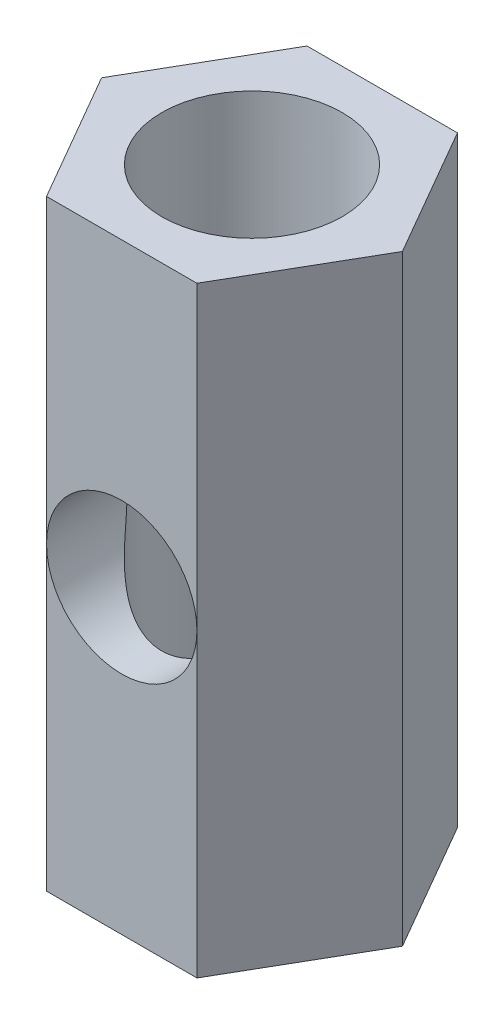
ISO-10303-21;
HEADER;
FILE_DESCRIPTION(('STEP AP214'),'2;1');
FILE_NAME('part.step','',(''),(''),'','','');
FILE_SCHEMA(('AUTOMOTIVE_DESIGN { 1 0 10303 214 1 1 1 1 }'));
ENDSEC;
DATA;
#1=APPLICATION_CONTEXT('core data for automotive mechanical design processes');
#2=APPLICATION_PROTOCOL_DEFINITION('international standard','automotive_design',2000,#1);
#3=PRODUCT_CONTEXT('',#1,'mechanical');
#4=PRODUCT('Part','Part','',(#3));
#5=PRODUCT_RELATED_PRODUCT_CATEGORY('part','',(#4));
#6=PRODUCT_DEFINITION_FORMATION('','',#4);
#7=PRODUCT_DEFINITION_CONTEXT('part definition',#1,'design');
#8=PRODUCT_DEFINITION('design','',#6,#7);
#9=PRODUCT_DEFINITION_SHAPE('','',#8);
#10=(LENGTH_UNIT() NAMED_UNIT(*) SI_UNIT(.MILLI.,.METRE.));
#11=(NAMED_UNIT(*) PLANE_ANGLE_UNIT() SI_UNIT($,.RADIAN.));
#12=(NAMED_UNIT(*) SI_UNIT($,.STERADIAN.) SOLID_ANGLE_UNIT());
#13=UNCERTAINTY_MEASURE_WITH_UNIT(LENGTH_MEASURE(1.E-05),#10,'distance_accuracy_value','');
#14=(GEOMETRIC_REPRESENTATION_CONTEXT(3) GLOBAL_UNCERTAINTY_ASSIGNED_CONTEXT((#13)) GLOBAL_UNIT_ASSIGNED_CONTEXT((#10,
#11,#12)) REPRESENTATION_CONTEXT('',''));
#15=CARTESIAN_POINT('',(0.,0.,0.));
#16=DIRECTION('',(0.,0.,1.));
#17=DIRECTION('',(1.,0.,0.));
#18=AXIS2_PLACEMENT_3D('',#15,#16,#17);
#19=CARTESIAN_POINT('',(-1.25,10.,2.1650635094611));
#20=DIRECTION('',(0.,0.,-1.));
#21=DIRECTION('',(-1.,0.,0.));
#22=AXIS2_PLACEMENT_3D('',#19,#20,#21);
#23=PLANE('',#22);
#24=DIRECTION('',(0.,-1.,0.));
#25=VECTOR('',#24,1.);
#26=CARTESIAN_POINT('',(-1.25,10.,2.1650635094611));
#27=LINE('',#26,#25);
#28=CARTESIAN_POINT('',(-1.25,10.,2.1650635094611));
#29=VERTEX_POINT('',#28);
#30=CARTESIAN_POINT('',(-1.25,5.,2.1650635094611));
#31=VERTEX_POINT('',#30);
#32=EDGE_CURVE('E185',#29,#31,#27,.T.);
#33=ORIENTED_EDGE('',*,*,#32,.T.);
#34=CARTESIAN_POINT('',(0.,5.,2.1650635094611));
#35=DIRECTION('',(0.,0.,1.));
#36=DIRECTION('',(1.,0.,0.));
#37=AXIS2_PLACEMENT_3D('',#34,#35,#36);
#38=CIRCLE('',#37,1.25);
#39=CARTESIAN_POINT('',(1.25,5.,2.1650635094611));
#40=VERTEX_POINT('',#39);
#41=EDGE_CURVE('E62',#40,#31,#38,.T.);
#42=ORIENTED_EDGE('',*,*,#41,.F.);
#43=DIRECTION('',(0.,-1.,0.));
#44=VECTOR('',#43,1.);
#45=CARTESIAN_POINT('',(1.25,10.,2.1650635094611));
#46=LINE('',#45,#44);
#47=CARTESIAN_POINT('',(1.25,10.,2.1650635094611));
#48=VERTEX_POINT('',#47);
#49=EDGE_CURVE('E11',#48,#40,#46,.T.);
#50=ORIENTED_EDGE('',*,*,#49,.F.);
#51=DIRECTION('',(1.,0.,0.));
#52=VECTOR('',#51,1.);
#53=CARTESIAN_POINT('',(-1.25,10.,2.1650635094611));
#54=LINE('',#53,#52);
#55=EDGE_CURVE('E183',#29,#48,#54,.T.);
#56=ORIENTED_EDGE('',*,*,#55,.F.);
#57=EDGE_LOOP('',(#33,#42,#50,#56));
#58=FACE_BOUND('',#57,.T.);
#59=ADVANCED_FACE('F35',(#58),#23,.F.);
#60=CARTESIAN_POINT('',(1.25,10.,-2.1650635094611));
#61=DIRECTION('',(0.,0.,1.));
#62=DIRECTION('',(1.,0.,0.));
#63=AXIS2_PLACEMENT_3D('',#60,#61,#62);
#64=PLANE('',#63);
#65=DIRECTION('',(0.,-1.,0.));
#66=VECTOR('',#65,1.);
#67=CARTESIAN_POINT('',(1.25,10.,-2.1650635094611));
#68=LINE('',#67,#66);
#69=CARTESIAN_POINT('',(1.25,10.,-2.1650635094611));
#70=VERTEX_POINT('',#69);
#71=CARTESIAN_POINT('',(1.25,5.,-2.1650635094611));
#72=VERTEX_POINT('',#71);
#73=EDGE_CURVE('E119',#70,#72,#68,.T.);
#74=ORIENTED_EDGE('',*,*,#73,.T.);
#75=CARTESIAN_POINT('',(0.,5.,-2.1650635094611));
#76=DIRECTION('',(0.,0.,1.));
#77=DIRECTION('',(1.,0.,0.));
#78=AXIS2_PLACEMENT_3D('',#75,#76,#77);
#79=CIRCLE('',#78,1.25);
#80=CARTESIAN_POINT('',(-1.25,5.,-2.1650635094611));
#81=VERTEX_POINT('',#80);
#82=EDGE_CURVE('E55',#72,#81,#79,.T.);
#83=ORIENTED_EDGE('',*,*,#82,.T.);
#84=DIRECTION('',(0.,-1.,0.));
#85=VECTOR('',#84,1.);
#86=CARTESIAN_POINT('',(-1.25,10.,-2.1650635094611));
#87=LINE('',#86,#85);
#88=CARTESIAN_POINT('',(-1.25,10.,-2.1650635094611));
#89=VERTEX_POINT('',#88);
#90=EDGE_CURVE('E116',#89,#81,#87,.T.);
#91=ORIENTED_EDGE('',*,*,#90,.F.);
#92=DIRECTION('',(-1.,0.,0.));
#93=VECTOR('',#92,1.);
#94=CARTESIAN_POINT('',(1.25,10.,-2.1650635094611));
#95=LINE('',#94,#93);
#96=EDGE_CURVE('E199',#70,#89,#95,.T.);
#97=ORIENTED_EDGE('',*,*,#96,.F.);
#98=EDGE_LOOP('',(#74,#83,#91,#97));
#99=FACE_BOUND('',#98,.T.);
#100=ADVANCED_FACE('F113',(#99),#64,.F.);
#101=CARTESIAN_POINT('',(0.,10.,0.));
#102=DIRECTION('',(0.,1.,0.));
#103=DIRECTION('',(0.,0.,1.));
#104=AXIS2_PLACEMENT_3D('',#101,#102,#103);
#105=PLANE('',#104);
#106=ORIENTED_EDGE('',*,*,#55,.T.);
#107=DIRECTION('',(0.5,0.,-0.866025403784439));
#108=VECTOR('',#107,1.);
#109=CARTESIAN_POINT('',(1.25,10.,2.1650635094611));
#110=LINE('',#109,#108);
#111=CARTESIAN_POINT('',(2.5,10.,0.));
#112=VERTEX_POINT('',#111);
#113=EDGE_CURVE('E180',#48,#112,#110,.T.);
#114=ORIENTED_EDGE('',*,*,#113,.T.);
#115=DIRECTION('',(-0.499999999999999,0.,-0.866025403784439));
#116=VECTOR('',#115,1.);
#117=CARTESIAN_POINT('',(2.5,10.,0.));
#118=LINE('',#117,#116);
#119=EDGE_CURVE('E197',#112,#70,#118,.T.);
#120=ORIENTED_EDGE('',*,*,#119,.T.);
#121=ORIENTED_EDGE('',*,*,#96,.T.);
#122=DIRECTION('',(-0.5,0.,0.866025403784438));
#123=VECTOR('',#122,1.);
#124=CARTESIAN_POINT('',(-1.25,10.,-2.1650635094611));
#125=LINE('',#124,#123);
#126=CARTESIAN_POINT('',(-2.5,10.,0.));
#127=VERTEX_POINT('',#126);
#128=EDGE_CURVE('E132',#89,#127,#125,.T.);
#129=ORIENTED_EDGE('',*,*,#128,.T.);
#130=DIRECTION('',(0.499999999999999,0.,0.866025403784439));
#131=VECTOR('',#130,1.);
#132=CARTESIAN_POINT('',(-2.5,10.,0.));
#133=LINE('',#132,#131);
#134=EDGE_CURVE('E202',#127,#29,#133,.T.);
#135=ORIENTED_EDGE('',*,*,#134,.T.);
#136=EDGE_LOOP('',(#106,#114,#120,#121,#129,#135));
#137=FACE_BOUND('',#136,.T.);
#138=CARTESIAN_POINT('',(0.,10.,0.));
#139=DIRECTION('',(0.,1.,0.));
#140=DIRECTION('',(0.,0.,1.));
#141=AXIS2_PLACEMENT_3D('',#138,#139,#140);
#142=CIRCLE('',#141,1.5);
#143=CARTESIAN_POINT('',(0.,10.,1.5));
#144=VERTEX_POINT('',#143);
#145=EDGE_CURVE('E191',#144,#144,#142,.T.);
#146=ORIENTED_EDGE('',*,*,#145,.F.);
#147=EDGE_LOOP('',(#146));
#148=FACE_BOUND('',#147,.T.);
#149=ADVANCED_FACE('F158',(#137,#148),#105,.T.);
#150=CARTESIAN_POINT('',(1.25,0.,2.1650635094611));
#151=VERTEX_POINT('',#150);
#152=EDGE_CURVE('E48',#40,#151,#46,.T.);
#153=ORIENTED_EDGE('',*,*,#152,.F.);
#154=EDGE_CURVE('E173',#31,#40,#38,.T.);
#155=ORIENTED_EDGE('',*,*,#154,.F.);
#156=CARTESIAN_POINT('',(-1.25,0.,2.1650635094611));
#157=VERTEX_POINT('',#156);
#158=EDGE_CURVE('E204',#31,#157,#27,.T.);
#159=ORIENTED_EDGE('',*,*,#158,.T.);
#160=DIRECTION('',(1.,0.,0.));
#161=VECTOR('',#160,1.);
#162=CARTESIAN_POINT('',(-1.25,0.,2.1650635094611));
#163=LINE('',#162,#161);
#164=EDGE_CURVE('E176',#157,#151,#163,.T.);
#165=ORIENTED_EDGE('',*,*,#164,.T.);
#166=EDGE_LOOP('',(#153,#155,#159,#165));
#167=FACE_BOUND('',#166,.T.);
#168=ADVANCED_FACE('F37',(#167),#23,.F.);
#169=CARTESIAN_POINT('',(1.25,10.,2.1650635094611));
#170=DIRECTION('',(-0.866025403784439,0.,-0.5));
#171=DIRECTION('',(-0.5,0.,0.866025403784439));
#172=AXIS2_PLACEMENT_3D('',#169,#170,#171);
#173=PLANE('',#172);
#174=DIRECTION('',(0.5,0.,-0.866025403784439));
#175=VECTOR('',#174,1.);
#176=CARTESIAN_POINT('',(1.25,0.,2.1650635094611));
#177=LINE('',#176,#175);
#178=CARTESIAN_POINT('',(2.5,0.,0.));
#179=VERTEX_POINT('',#178);
#180=EDGE_CURVE('E206',#151,#179,#177,.T.);
#181=ORIENTED_EDGE('',*,*,#180,.T.);
#182=DIRECTION('',(0.,-1.,0.));
#183=VECTOR('',#182,1.);
#184=CARTESIAN_POINT('',(2.5,10.,0.));
#185=LINE('',#184,#183);
#186=EDGE_CURVE('E138',#112,#179,#185,.T.);
#187=ORIENTED_EDGE('',*,*,#186,.F.);
#188=ORIENTED_EDGE('',*,*,#113,.F.);
#189=ORIENTED_EDGE('',*,*,#49,.T.);
#190=ORIENTED_EDGE('',*,*,#152,.T.);
#191=EDGE_LOOP('',(#181,#187,#188,#189,#190));
#192=FACE_BOUND('',#191,.T.);
#193=ADVANCED_FACE('F162',(#192),#173,.F.);
#194=CARTESIAN_POINT('',(2.5,10.,0.));
#195=DIRECTION('',(-0.866025403784439,0.,0.499999999999999));
#196=DIRECTION('',(0.499999999999999,0.,0.866025403784439));
#197=AXIS2_PLACEMENT_3D('',#194,#195,#196);
#198=PLANE('',#197);
#199=DIRECTION('',(-0.499999999999999,0.,-0.866025403784439));
#200=VECTOR('',#199,1.);
#201=CARTESIAN_POINT('',(2.5,0.,0.));
#202=LINE('',#201,#200);
#203=CARTESIAN_POINT('',(1.25,0.,-2.1650635094611));
#204=VERTEX_POINT('',#203);
#205=EDGE_CURVE('E208',#179,#204,#202,.T.);
#206=ORIENTED_EDGE('',*,*,#205,.T.);
#207=EDGE_CURVE('E133',#72,#204,#68,.T.);
#208=ORIENTED_EDGE('',*,*,#207,.F.);
#209=ORIENTED_EDGE('',*,*,#73,.F.);
#210=ORIENTED_EDGE('',*,*,#119,.F.);
#211=ORIENTED_EDGE('',*,*,#186,.T.);
#212=EDGE_LOOP('',(#206,#208,#209,#210,#211));
#213=FACE_BOUND('',#212,.T.);
#214=ADVANCED_FACE('F168',(#213),#198,.F.);
#215=CARTESIAN_POINT('',(-1.25,0.,-2.1650635094611));
#216=VERTEX_POINT('',#215);
#217=EDGE_CURVE('E122',#81,#216,#87,.T.);
#218=ORIENTED_EDGE('',*,*,#217,.F.);
#219=EDGE_CURVE('E103',#81,#72,#79,.T.);
#220=ORIENTED_EDGE('',*,*,#219,.T.);
#221=ORIENTED_EDGE('',*,*,#207,.T.);
#222=DIRECTION('',(-1.,0.,0.));
#223=VECTOR('',#222,1.);
#224=CARTESIAN_POINT('',(1.25,0.,-2.1650635094611));
#225=LINE('',#224,#223);
#226=EDGE_CURVE('E125',#204,#216,#225,.T.);
#227=ORIENTED_EDGE('',*,*,#226,.T.);
#228=EDGE_LOOP('',(#218,#220,#221,#227));
#229=FACE_BOUND('',#228,.T.);
#230=ADVANCED_FACE('F123',(#229),#64,.F.);
#231=CARTESIAN_POINT('',(-1.25,10.,-2.1650635094611));
#232=DIRECTION('',(0.866025403784438,0.,0.5));
#233=DIRECTION('',(0.500000000000001,0.,-0.866025403784438));
#234=AXIS2_PLACEMENT_3D('',#231,#232,#233);
#235=PLANE('',#234);
#236=DIRECTION('',(-0.5,0.,0.866025403784438));
#237=VECTOR('',#236,1.);
#238=CARTESIAN_POINT('',(-1.25,0.,-2.1650635094611));
#239=LINE('',#238,#237);
#240=CARTESIAN_POINT('',(-2.5,0.,0.));
#241=VERTEX_POINT('',#240);
#242=EDGE_CURVE('E212',#216,#241,#239,.T.);
#243=ORIENTED_EDGE('',*,*,#242,.T.);
#244=DIRECTION('',(0.,-1.,0.));
#245=VECTOR('',#244,1.);
#246=CARTESIAN_POINT('',(-2.5,10.,0.));
#247=LINE('',#246,#245);
#248=EDGE_CURVE('E128',#127,#241,#247,.T.);
#249=ORIENTED_EDGE('',*,*,#248,.F.);
#250=ORIENTED_EDGE('',*,*,#128,.F.);
#251=ORIENTED_EDGE('',*,*,#90,.T.);
#252=ORIENTED_EDGE('',*,*,#217,.T.);
#253=EDGE_LOOP('',(#243,#249,#250,#251,#252));
#254=FACE_BOUND('',#253,.T.);
#255=ADVANCED_FACE('F130',(#254),#235,.F.);
#256=CARTESIAN_POINT('',(-2.5,10.,0.));
#257=DIRECTION('',(0.866025403784439,0.,-0.499999999999999));
#258=DIRECTION('',(-0.499999999999999,0.,-0.866025403784439));
#259=AXIS2_PLACEMENT_3D('',#256,#257,#258);
#260=PLANE('',#259);
#261=DIRECTION('',(0.499999999999999,0.,0.866025403784439));
#262=VECTOR('',#261,1.);
#263=CARTESIAN_POINT('',(-2.5,0.,0.));
#264=LINE('',#263,#262);
#265=EDGE_CURVE('E195',#241,#157,#264,.T.);
#266=ORIENTED_EDGE('',*,*,#265,.T.);
#267=ORIENTED_EDGE('',*,*,#158,.F.);
#268=ORIENTED_EDGE('',*,*,#32,.F.);
#269=ORIENTED_EDGE('',*,*,#134,.F.);
#270=ORIENTED_EDGE('',*,*,#248,.T.);
#271=EDGE_LOOP('',(#266,#267,#268,#269,#270));
#272=FACE_BOUND('',#271,.T.);
#273=ADVANCED_FACE('F218',(#272),#260,.F.);
#274=CARTESIAN_POINT('',(0.,0.,0.));
#275=DIRECTION('',(0.,1.,0.));
#276=DIRECTION('',(0.,0.,1.));
#277=AXIS2_PLACEMENT_3D('',#274,#275,#276);
#278=PLANE('',#277);
#279=CARTESIAN_POINT('',(0.,0.,0.));
#280=DIRECTION('',(0.,-1.,0.));
#281=DIRECTION('',(0.,0.,-1.));
#282=AXIS2_PLACEMENT_3D('',#279,#280,#281);
#283=CIRCLE('',#282,1.5);
#284=CARTESIAN_POINT('',(0.,0.,-1.5));
#285=VERTEX_POINT('',#284);
#286=EDGE_CURVE('E188',#285,#285,#283,.T.);
#287=ORIENTED_EDGE('',*,*,#286,.F.);
#288=EDGE_LOOP('',(#287));
#289=FACE_BOUND('',#288,.T.);
#290=ORIENTED_EDGE('',*,*,#164,.F.);
#291=ORIENTED_EDGE('',*,*,#265,.F.);
#292=ORIENTED_EDGE('',*,*,#242,.F.);
#293=ORIENTED_EDGE('',*,*,#226,.F.);
#294=ORIENTED_EDGE('',*,*,#205,.F.);
#295=ORIENTED_EDGE('',*,*,#180,.F.);
#296=EDGE_LOOP('',(#290,#291,#292,#293,#294,#295));
#297=FACE_BOUND('',#296,.T.);
#298=ADVANCED_FACE('F221',(#289,#297),#278,.F.);
#299=CARTESIAN_POINT('',(0.,15.,0.));
#300=DIRECTION('',(0.,-1.,0.));
#301=DIRECTION('',(0.,0.,-1.));
#302=AXIS2_PLACEMENT_3D('',#299,#300,#301);
#303=CYLINDRICAL_SURFACE('',#302,1.5);
#304=CARTESIAN_POINT('',(0.,6.25,-1.5));
#305=CARTESIAN_POINT('',(0.0593787688504968,6.24999755162014,-1.49999760600508));
#306=CARTESIAN_POINT('',(0.118775657075964,6.24573873608633,-1.49644333306022));
#307=CARTESIAN_POINT('',(0.235591229710263,6.22901865029432,-1.48255383426958));
#308=CARTESIAN_POINT('',(0.293008415894373,6.21655130529972,-1.47221358646978));
#309=CARTESIAN_POINT('',(0.403915034737321,6.18434389929648,-1.44571337985919));
#310=CARTESIAN_POINT('',(0.457425697494257,6.16464730700095,-1.42958821794707));
#311=CARTESIAN_POINT('',(0.55992045809506,6.11899163190361,-1.39264614580735));
#312=CARTESIAN_POINT('',(0.608903018804499,6.09303043320279,-1.37182765054183));
#313=CARTESIAN_POINT('',(0.7189512027702,6.02527232994863,-1.31836960624056));
#314=CARTESIAN_POINT('',(0.77784638468749,5.98116142459715,-1.28419684309181));
#315=CARTESIAN_POINT('',(0.886006690341646,5.88474132022428,-1.21211904371339));
#316=CARTESIAN_POINT('',(0.935244207719105,5.83240936777461,-1.17420376089562));
#317=CARTESIAN_POINT('',(1.02476981505215,5.71947566655176,-1.0969954782186));
#318=CARTESIAN_POINT('',(1.06487540714462,5.6587387889954,-1.05768996729306));
#319=CARTESIAN_POINT('',(1.13460946975339,5.52964932775321,-0.982473378237859));
#320=CARTESIAN_POINT('',(1.16426870455503,5.46131989924884,-0.946552565043526));
#321=CARTESIAN_POINT('',(1.20096809386344,5.34915232182339,-0.898966702929831));
#322=CARTESIAN_POINT('',(1.2121691769959,5.30823415135928,-0.883683453779613));
#323=CARTESIAN_POINT('',(1.23050643018312,5.22405890858107,-0.857964009892268));
#324=CARTESIAN_POINT('',(1.23765246650147,5.1808077960169,-0.847516062002446));
#325=CARTESIAN_POINT('',(1.24740539483339,5.09211619323376,-0.833105139761353));
#326=CARTESIAN_POINT('',(1.24995600781898,5.04665546916851,-0.829222605301797));
#327=CARTESIAN_POINT('',(1.25004286433054,4.95571924480199,-0.829091490172101));
#328=CARTESIAN_POINT('',(1.24757904212979,4.91024374431486,-0.832843009565336));
#329=CARTESIAN_POINT('',(1.23752620102327,4.81723645016103,-0.847707888605652));
#330=CARTESIAN_POINT('',(1.2295274513961,4.76984879740241,-0.859408312456977));
#331=CARTESIAN_POINT('',(1.20871318849993,4.67789885416051,-0.888442533165815));
#332=CARTESIAN_POINT('',(1.19588169148344,4.63334651912334,-0.905794997455962));
#333=CARTESIAN_POINT('',(1.15722563130129,4.52189560230473,-0.955139134708251));
#334=CARTESIAN_POINT('',(1.12819923859671,4.45728511979404,-0.989734541742255));
#335=CARTESIAN_POINT('',(1.06071724104509,4.33497126098837,-1.0617636269616));
#336=CARTESIAN_POINT('',(1.02224478491081,4.2772805059593,-1.09920229401549));
#337=CARTESIAN_POINT('',(0.933838554257845,4.16587958721673,-1.1753849598887));
#338=CARTESIAN_POINT('',(0.883411408236041,4.11253430361172,-1.21409510992798));
#339=CARTESIAN_POINT('',(0.772419565040708,4.0144403695611,-1.28754911495831));
#340=CARTESIAN_POINT('',(0.711877274428603,3.96967317783162,-1.32230145708774));
#341=CARTESIAN_POINT('',(0.597056314169013,3.9002931891689,-1.37714389382958));
#342=CARTESIAN_POINT('',(0.544863772530718,3.87342871405698,-1.39874156893189));
#343=CARTESIAN_POINT('',(0.435535617240939,3.8268284643236,-1.43653920142357));
#344=CARTESIAN_POINT('',(0.378403116632069,3.80708824017554,-1.45274252741888));
#345=CARTESIAN_POINT('',(0.259977180591786,3.77579141940212,-1.47854912184039));
#346=CARTESIAN_POINT('',(0.19865546832505,3.76429803928537,-1.4881013901647));
#347=CARTESIAN_POINT('',(0.0742799817040137,3.7506453714307,-1.49945718724959));
#348=CARTESIAN_POINT('',(0.01122739468355,3.7484798384778,-1.50126590049908));
#349=CARTESIAN_POINT('',(-0.106655102299875,3.75333122508868,-1.49722498729296));
#350=CARTESIAN_POINT('',(-0.161565285324134,3.75927932977238,-1.49226673517921));
#351=CARTESIAN_POINT('',(-0.269322467292295,3.77813346468969,-1.47662796570524));
#352=CARTESIAN_POINT('',(-0.322169217931408,3.79104032956087,-1.46594676193199));
#353=CARTESIAN_POINT('',(-0.425282807428031,3.82331173451289,-1.43944754113185));
#354=CARTESIAN_POINT('',(-0.47550555866547,3.84276053215233,-1.42356257517914));
#355=CARTESIAN_POINT('',(-0.57182928685617,3.88719767868728,-1.38768087304246));
#356=CARTESIAN_POINT('',(-0.617928731328795,3.9121880752831,-1.36768261713727));
#357=CARTESIAN_POINT('',(-0.725338376691815,3.9792166414649,-1.31487441147003));
#358=CARTESIAN_POINT('',(-0.784177111169749,4.02386964637632,-1.2803451352154));
#359=CARTESIAN_POINT('',(-0.892139643516472,4.12141682602765,-1.20761833212685));
#360=CARTESIAN_POINT('',(-0.941232285418756,4.17433649377555,-1.16940960315472));
#361=CARTESIAN_POINT('',(-1.03033901299862,4.28848795246965,-1.09176431315108));
#362=CARTESIAN_POINT('',(-1.07017375330095,4.34985223063404,-1.05231803111603));
#363=CARTESIAN_POINT('',(-1.13922410535012,4.48029258014805,-0.977105860325171));
#364=CARTESIAN_POINT('',(-1.16847444328379,4.54934244271883,-0.941328217251967));
#365=CARTESIAN_POINT('',(-1.20418713962594,4.66214898470544,-0.894635188877059));
#366=CARTESIAN_POINT('',(-1.21494166451886,4.70292093843127,-0.87985553504527));
#367=CARTESIAN_POINT('',(-1.23241118575506,4.7867222734119,-0.855213348293514));
#368=CARTESIAN_POINT('',(-1.23913627036995,4.82974572127115,-0.845338546087726));
#369=CARTESIAN_POINT('',(-1.24808646608227,4.91781988033098,-0.832077095797259));
#370=CARTESIAN_POINT('',(-1.25025897513146,4.96288820694844,-0.828766313990398));
#371=CARTESIAN_POINT('',(-1.2496910063161,5.05292606417594,-0.829621484389405));
#372=CARTESIAN_POINT('',(-1.24694923297196,5.09789556560516,-0.833789408096102));
#373=CARTESIAN_POINT('',(-1.23632620681835,5.19083749596596,-0.849464182651573));
#374=CARTESIAN_POINT('',(-1.22792861456552,5.23861956187494,-0.861705472805828));
#375=CARTESIAN_POINT('',(-1.20625214805457,5.33126120670839,-0.891795027098421));
#376=CARTESIAN_POINT('',(-1.19295712996404,5.37611053579842,-0.909661806430615));
#377=CARTESIAN_POINT('',(-1.15299054037422,5.48834179814999,-0.960293381079566));
#378=CARTESIAN_POINT('',(-1.12305667484075,5.55338132903309,-0.995623570298246));
#379=CARTESIAN_POINT('',(-1.05354944095066,5.67640963589639,-1.06893108151569));
#380=CARTESIAN_POINT('',(-1.01395911755893,5.73438573828657,-1.10691297478657));
#381=CARTESIAN_POINT('',(-0.923157683511356,5.84599075337962,-1.18384825527244));
#382=CARTESIAN_POINT('',(-0.871472234833908,5.89926748450174,-1.22275805975957));
#383=CARTESIAN_POINT('',(-0.757765343279744,5.99693530462558,-1.29628639574608));
#384=CARTESIAN_POINT('',(-0.695767358080718,6.04134606754814,-1.33091436227141));
#385=CARTESIAN_POINT('',(-0.579278005881087,6.10915651690689,-1.38471086227025));
#386=CARTESIAN_POINT('',(-0.526999500141295,6.13501910031224,-1.40556069252779));
#387=CARTESIAN_POINT('',(-0.417719782772166,6.17960948970954,-1.44180748060126));
#388=CARTESIAN_POINT('',(-0.360724986716914,6.1983468000958,-1.45721170036654));
#389=CARTESIAN_POINT('',(-0.253310041564238,6.22509419634338,-1.47929369322442));
#390=CARTESIAN_POINT('',(-0.203422739425068,6.23438755201361,-1.48701070119816));
#391=CARTESIAN_POINT('',(-0.102361357783545,6.24684119321788,-1.49736462476332));
#392=CARTESIAN_POINT('',(-0.0511874114043623,6.25000211062354,-1.50000206374105));
#393=CARTESIAN_POINT('',(0.,6.25,-1.5));
#394=B_SPLINE_CURVE_WITH_KNOTS('',3,(#304,#305,#306,#307,#308,#309,#310,#311,#312,#313,#314,
#315,#316,#317,#318,#319,#320,#321,#322,#323,#324,#325,#326,#327,#328,#329,#330,#331,#332,#333,
#334,#335,#336,#337,#338,#339,#340,#341,#342,#343,#344,#345,#346,#347,#348,#349,#350,#351,#352,
#353,#354,#355,#356,#357,#358,#359,#360,#361,#362,#363,#364,#365,#366,#367,#368,#369,#370,#371,
#372,#373,#374,#375,#376,#377,#378,#379,#380,#381,#382,#383,#384,#385,#386,#387,#388,#389,#390,
#391,#392,#393),.UNSPECIFIED.,.T.,.F.,(4,2,2,2,2,2,2,2,2,2,2,2,2,2,2,2,2,2,2,2,2,2,2,2,2,2,2,2,
2,2,2,2,2,2,2,2,2,2,2,2,2,2,2,2,4),(0.,0.177920638407557,0.35597309551348,0.532972026797753,
0.710030824150578,0.952125893800631,1.19490321558387,1.44217376408651,1.6887098948694,
1.8236131816748,1.95818681458038,2.0943976161209,2.23061020305627,2.37816635242836,
2.52621487430063,2.76143398970636,2.9970758121581,3.24501566810455,3.49241341014753,
3.67933989515107,3.86614943036557,4.0543760919618,4.242476711735,4.40804641875283,
4.57363598871256,4.74144560410123,4.90931733118537,5.152610891086,5.39667010414655,
5.64512295341126,5.89275310452977,6.02641745468303,6.15974574356462,6.29460624678873,
6.42950230652136,6.57876724728639,6.72852869227185,6.96677041328345,7.20543349464891,
7.45579032127001,7.7055852656125,7.89070171070692,8.07557035570182,8.22896247938917,
8.3823387970832),.UNSPECIFIED.);
#395=CARTESIAN_POINT('',(0.,6.25,-1.5));
#396=VERTEX_POINT('',#395);
#397=EDGE_CURVE('E39',#396,#396,#394,.T.);
#398=ORIENTED_EDGE('',*,*,#397,.T.);
#399=EDGE_LOOP('',(#398));
#400=FACE_BOUND('',#399,.T.);
#401=CARTESIAN_POINT('',(1.25,5.,0.829156197588849));
#402=CARTESIAN_POINT('',(1.24999404087226,5.04416470538021,0.829171080733846));
#403=CARTESIAN_POINT('',(1.24763049967423,5.08838352122019,0.832762375395264));
#404=CARTESIAN_POINT('',(1.23841578381773,5.17538530124638,0.84639629042703));
#405=CARTESIAN_POINT('',(1.23154918841669,5.21816279845574,0.856461077033122));
#406=CARTESIAN_POINT('',(1.21043365494066,5.31755543299884,0.886166295980816));
#407=CARTESIAN_POINT('',(1.19435434755409,5.37310208001594,0.908006666466335));
#408=CARTESIAN_POINT('',(1.15573690008527,5.47958263511899,0.956683967866317));
#409=CARTESIAN_POINT('',(1.13317786130272,5.53050090455106,0.983536965992067));
#410=CARTESIAN_POINT('',(1.070817065168,5.64975837508035,1.05182143936407));
#411=CARTESIAN_POINT('',(1.02781025867357,5.71575985410453,1.09442045045525));
#412=CARTESIAN_POINT('',(0.929991014491965,5.83891509928546,1.17868626480119));
#413=CARTESIAN_POINT('',(0.875189620049187,5.89607705641117,1.22035390008919));
#414=CARTESIAN_POINT('',(0.766663658737561,5.98929011660765,1.29053257092503));
#415=CARTESIAN_POINT('',(0.715176307152023,6.02724727919612,1.31995958434628));
#416=CARTESIAN_POINT('',(0.605134546053413,6.09567035779853,1.37388140866488));
#417=CARTESIAN_POINT('',(0.546591815897452,6.12614840737724,1.3983841964128));
#418=CARTESIAN_POINT('',(0.43396568854128,6.173556063108,1.43686412264528));
#419=CARTESIAN_POINT('',(0.380860387543684,6.19191688378329,1.45192852122773));
#420=CARTESIAN_POINT('',(0.27141697450591,6.2214903033312,1.47630204543213));
#421=CARTESIAN_POINT('',(0.215080746020966,6.23270702178971,1.48561448777698));
#422=CARTESIAN_POINT('',(0.100453129804022,6.2473007228839,1.49774576733632));
#423=CARTESIAN_POINT('',(0.0421545865612126,6.25064491421972,1.50053744334289));
#424=CARTESIAN_POINT('',(-0.0742637120693279,6.24914887809637,1.4992907190875));
#425=CARTESIAN_POINT('',(-0.132383471389192,6.24430883194758,1.49525247013301));
#426=CARTESIAN_POINT('',(-0.242722987690762,6.22739289605122,1.48120670588946));
#427=CARTESIAN_POINT('',(-0.295076907899645,6.21582452214335,1.47161807443048));
#428=CARTESIAN_POINT('',(-0.396813223309236,6.18652600330558,1.44750645993));
#429=CARTESIAN_POINT('',(-0.446195191050166,6.16879497446605,1.43298276905958));
#430=CARTESIAN_POINT('',(-0.545266441516649,6.12620474375289,1.39845194139805));
#431=CARTESIAN_POINT('',(-0.594620394489257,6.10086539417457,1.3780819168441));
#432=CARTESIAN_POINT('',(-0.688391071359199,6.04480037361997,1.33372220395884));
#433=CARTESIAN_POINT('',(-0.732803298534893,6.0140698614123,1.30972926499254));
#434=CARTESIAN_POINT('',(-0.83639372253195,5.93227740848526,1.24725283392922));
#435=CARTESIAN_POINT('',(-0.892549793915361,5.8784966096062,1.20730441725272));
#436=CARTESIAN_POINT('',(-0.99363852917749,5.76232443114911,1.1255679714589));
#437=CARTESIAN_POINT('',(-1.03855119382815,5.6999180103951,1.08377681764698));
#438=CARTESIAN_POINT('',(-1.10642031272616,5.58441929350592,1.01367839645618));
#439=CARTESIAN_POINT('',(-1.13203948271785,5.53326254482451,0.984740465846713));
#440=CARTESIAN_POINT('',(-1.17656863192196,5.4260750534637,0.931069709507046));
#441=CARTESIAN_POINT('',(-1.19549764866108,5.37005871514294,0.90632505768752));
#442=CARTESIAN_POINT('',(-1.2207056855963,5.27208893578056,0.871882971831379));
#443=CARTESIAN_POINT('',(-1.22909685175358,5.23150038212869,0.859909724231178));
#444=CARTESIAN_POINT('',(-1.24185130532595,5.1485196693188,0.841388366026597));
#445=CARTESIAN_POINT('',(-1.24622406437787,5.10613199902475,0.834827501853269));
#446=CARTESIAN_POINT('',(-1.25057759306024,5.02028601228656,0.828296528501302));
#447=CARTESIAN_POINT('',(-1.25052664975154,4.97682219866485,0.828374008685672));
#448=CARTESIAN_POINT('',(-1.24595802348496,4.89064745065353,0.835225782947459));
#449=CARTESIAN_POINT('',(-1.2414341556627,4.84793764208718,0.842009349756119));
#450=CARTESIAN_POINT('',(-1.22668003680201,4.75390646428801,0.863399128259968));
#451=CARTESIAN_POINT('',(-1.21529777259545,4.70313208960554,0.879547518492398));
#452=CARTESIAN_POINT('',(-1.18711365735935,4.60518922100382,0.917232747019938));
#453=CARTESIAN_POINT('',(-1.17029389583343,4.55803328994198,0.938787339391923));
#454=CARTESIAN_POINT('',(-1.12091579801676,4.44138936969155,0.997868621064608));
#455=CARTESIAN_POINT('',(-1.08484810385271,4.37446452954936,1.03750412177145));
#456=CARTESIAN_POINT('',(-1.00177028688711,4.24857371632911,1.11795958286266));
#457=CARTESIAN_POINT('',(-0.95474431153985,4.18961947085346,1.15878118348296));
#458=CARTESIAN_POINT('',(-0.848446129663135,4.07876053958777,1.23882330951385));
#459=CARTESIAN_POINT('',(-0.788892937369297,4.02707322352613,1.27797673016273));
#460=CARTESIAN_POINT('',(-0.658554811895194,3.93457074879173,1.34974000513072));
#461=CARTESIAN_POINT('',(-0.587808772156703,3.89371920684041,1.38237166417956));
#462=CARTESIAN_POINT('',(-0.461595088972367,3.83702826429526,1.42822592109972));
#463=CARTESIAN_POINT('',(-0.408859439024261,3.8173880886566,1.44429507033464));
#464=CARTESIAN_POINT('',(-0.299904276444416,3.78518537245677,1.47077851557488));
#465=CARTESIAN_POINT('',(-0.243687513640121,3.77261732263686,1.4811972131105));
#466=CARTESIAN_POINT('',(-0.128950522663662,3.75531047922875,1.49556964902824));
#467=CARTESIAN_POINT('',(-0.0704205711750227,3.75060938411023,1.4994922572063));
#468=CARTESIAN_POINT('',(0.0467748285323633,3.74950244256502,1.50041455454009));
#469=CARTESIAN_POINT('',(0.105440266542953,3.75309599032293,1.49741474928776));
#470=CARTESIAN_POINT('',(0.216739569352151,3.76774744138822,1.48523794227419));
#471=CARTESIAN_POINT('',(0.269501624532624,3.77824292393868,1.47652651443398));
#472=CARTESIAN_POINT('',(0.372221179705344,3.80552202058619,1.454035179736));
#473=CARTESIAN_POINT('',(0.422178239716069,3.82230661802057,1.44025448027619));
#474=CARTESIAN_POINT('',(0.521919916074483,3.86280826049913,1.40732209423503));
#475=CARTESIAN_POINT('',(0.571429449732359,3.88693968014984,1.38785344874152));
#476=CARTESIAN_POINT('',(0.665676902134276,3.94060367327501,1.34519757223152));
#477=CARTESIAN_POINT('',(0.710411099504559,3.97014041110857,1.32200747584648));
#478=CARTESIAN_POINT('',(0.81500495879082,4.04901521279332,1.26133215586173));
#479=CARTESIAN_POINT('',(0.87191685643911,4.1010828180055,1.22230011385721));
#480=CARTESIAN_POINT('',(0.974772820153254,4.21376516184283,1.14196239842367));
#481=CARTESIAN_POINT('',(1.02069344825836,4.2743977346542,1.10065209341852));
#482=CARTESIAN_POINT('',(1.09255581437418,4.38976833872727,1.02874460749124));
#483=CARTESIAN_POINT('',(1.12067062123728,4.44292741295027,0.997768980763184));
#484=CARTESIAN_POINT('',(1.16954598910695,4.55462162074648,0.939989503311798));
#485=CARTESIAN_POINT('',(1.1903265794276,4.61314155416062,0.913174404589166));
#486=CARTESIAN_POINT('',(1.21778307121979,4.71493875653809,0.87598470926776));
#487=CARTESIAN_POINT('',(1.22685233579968,4.75663962394329,0.863119730558271));
#488=CARTESIAN_POINT('',(1.24072116574167,4.8420112171475,0.843069286999134));
#489=CARTESIAN_POINT('',(1.24553715368945,4.88567367610932,0.835861989029705));
#490=CARTESIAN_POINT('',(1.2493403884987,4.95307006590597,0.830150605780695));
#491=CARTESIAN_POINT('',(1.2500031671507,4.97652739066684,0.829148287511217));
#492=CARTESIAN_POINT('',(1.25,5.,0.829156197588849));
#493=B_SPLINE_CURVE_WITH_KNOTS('',3,(#401,#402,#403,#404,#405,#406,#407,#408,#409,#410,#411,
#412,#413,#414,#415,#416,#417,#418,#419,#420,#421,#422,#423,#424,#425,#426,#427,#428,#429,#430,
#431,#432,#433,#434,#435,#436,#437,#438,#439,#440,#441,#442,#443,#444,#445,#446,#447,#448,#449,
#450,#451,#452,#453,#454,#455,#456,#457,#458,#459,#460,#461,#462,#463,#464,#465,#466,#467,#468,
#469,#470,#471,#472,#473,#474,#475,#476,#477,#478,#479,#480,#481,#482,#483,#484,#485,#486,#487,
#488,#489,#490,#491,#492),.UNSPECIFIED.,.T.,.F.,(4,2,2,2,2,2,2,2,2,2,2,2,2,2,2,2,2,2,2,2,2,2,2,
2,2,2,2,2,2,2,2,2,2,2,2,2,2,2,2,2,2,2,2,2,2,4),(0.,0.132403743422232,0.265263288930074,
0.449655855557674,0.634649942144407,0.902012441026489,1.16912568969086,1.37958069530741,
1.58969198279197,1.76348814983066,1.93718400783419,2.11160208780426,2.2860163038354,
2.44872292747117,2.61145289775614,2.7881084872776,2.96492353213236,3.22582525437774,
3.48718781023124,3.67905555270854,3.87037283441414,3.9993530692101,4.12802850386463,
4.25762647137534,4.38740388935218,4.54993403686822,4.71300509008802,4.96887834533348,
5.22512407721335,5.48788549042255,5.74975312897907,5.9246269566114,6.09936436646697,
6.27493674560801,6.45049630188436,6.61327577206191,6.77608070432303,6.95068885647625,
7.1254321007351,7.38342809840436,7.64196944496193,7.8443700438555,8.04621354192262,
8.17947958193175,8.31222878184588,8.38259857865178),.UNSPECIFIED.);
#494=CARTESIAN_POINT('',(1.25,5.,0.829156197588849));
#495=VERTEX_POINT('',#494);
#496=EDGE_CURVE('E120',#495,#495,#493,.T.);
#497=ORIENTED_EDGE('',*,*,#496,.T.);
#498=EDGE_LOOP('',(#497));
#499=FACE_BOUND('',#498,.T.);
#500=ORIENTED_EDGE('',*,*,#145,.T.);
#501=EDGE_LOOP('',(#500));
#502=FACE_BOUND('',#501,.T.);
#503=ORIENTED_EDGE('',*,*,#286,.T.);
#504=EDGE_LOOP('',(#503));
#505=FACE_BOUND('',#504,.T.);
#506=ADVANCED_FACE('F143',(#400,#499,#502,#505),#303,.F.);
#507=CARTESIAN_POINT('',(0.,5.,-2.1650635094611));
#508=DIRECTION('',(0.,0.,1.));
#509=DIRECTION('',(1.,0.,0.));
#510=AXIS2_PLACEMENT_3D('',#507,#508,#509);
#511=CYLINDRICAL_SURFACE('',#510,1.25);
#512=ORIENTED_EDGE('',*,*,#41,.T.);
#513=ORIENTED_EDGE('',*,*,#154,.T.);
#514=EDGE_LOOP('',(#512,#513));
#515=FACE_BOUND('',#514,.T.);
#516=ORIENTED_EDGE('',*,*,#496,.F.);
#517=EDGE_LOOP('',(#516));
#518=FACE_BOUND('',#517,.T.);
#519=ADVANCED_FACE('F148',(#515,#518),#511,.F.);
#520=ORIENTED_EDGE('',*,*,#82,.F.);
#521=ORIENTED_EDGE('',*,*,#219,.F.);
#522=EDGE_LOOP('',(#520,#521));
#523=FACE_BOUND('',#522,.T.);
#524=ORIENTED_EDGE('',*,*,#397,.F.);
#525=EDGE_LOOP('',(#524));
#526=FACE_BOUND('',#525,.T.);
#527=ADVANCED_FACE('F104',(#523,#526),#511,.F.);
#528=CLOSED_SHELL('',(#59,#100,#149,#168,#193,#214,#230,#255,#273,#298,#506,#519,#527));
#529=MANIFOLD_SOLID_BREP('B2',#528);
#530=ADVANCED_BREP_SHAPE_REPRESENTATION('',(#18,#529),#14);
#531=SHAPE_DEFINITION_REPRESENTATION(#9,#530);
ENDSEC;
END-ISO-10303-21;
